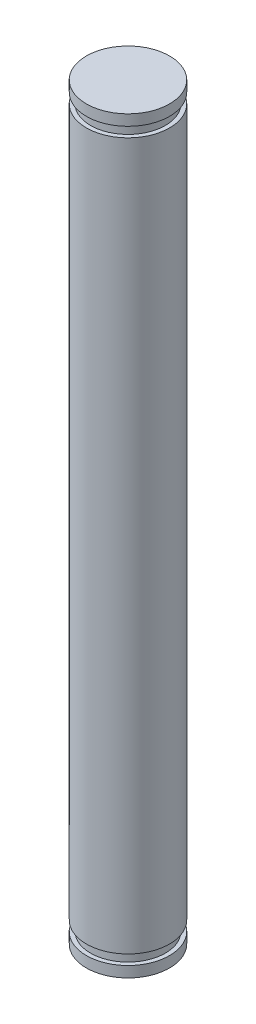
ISO-10303-21;
HEADER;
FILE_DESCRIPTION(('STEP AP214'),'2;1');
FILE_NAME('part.step','',(''),(''),'','','');
FILE_SCHEMA(('AUTOMOTIVE_DESIGN { 1 0 10303 214 1 1 1 1 }'));
ENDSEC;
DATA;
#1=APPLICATION_CONTEXT('core data for automotive mechanical design processes');
#2=APPLICATION_PROTOCOL_DEFINITION('international standard','automotive_design',2000,#1);
#3=PRODUCT_CONTEXT('',#1,'mechanical');
#4=PRODUCT('Part','Part','',(#3));
#5=PRODUCT_RELATED_PRODUCT_CATEGORY('part','',(#4));
#6=PRODUCT_DEFINITION_FORMATION('','',#4);
#7=PRODUCT_DEFINITION_CONTEXT('part definition',#1,'design');
#8=PRODUCT_DEFINITION('design','',#6,#7);
#9=PRODUCT_DEFINITION_SHAPE('','',#8);
#10=(LENGTH_UNIT() NAMED_UNIT(*) SI_UNIT(.MILLI.,.METRE.));
#11=(NAMED_UNIT(*) PLANE_ANGLE_UNIT() SI_UNIT($,.RADIAN.));
#12=(NAMED_UNIT(*) SI_UNIT($,.STERADIAN.) SOLID_ANGLE_UNIT());
#13=UNCERTAINTY_MEASURE_WITH_UNIT(LENGTH_MEASURE(1.E-05),#10,'distance_accuracy_value','');
#14=(GEOMETRIC_REPRESENTATION_CONTEXT(3) GLOBAL_UNCERTAINTY_ASSIGNED_CONTEXT((#13)) GLOBAL_UNIT_ASSIGNED_CONTEXT((#10,
#11,#12)) REPRESENTATION_CONTEXT('',''));
#15=CARTESIAN_POINT('',(0.,0.,0.));
#16=DIRECTION('',(0.,0.,1.));
#17=DIRECTION('',(1.,0.,0.));
#18=AXIS2_PLACEMENT_3D('',#15,#16,#17);
#19=CARTESIAN_POINT('',(0.,0.,0.));
#20=DIRECTION('',(0.,-1.,0.));
#21=DIRECTION('',(1.,0.,0.));
#22=AXIS2_PLACEMENT_3D('',#19,#20,#21);
#23=PLANE('',#22);
#24=CARTESIAN_POINT('',(0.,0.,0.));
#25=DIRECTION('',(0.,1.,0.));
#26=DIRECTION('',(-1.,0.,0.));
#27=AXIS2_PLACEMENT_3D('',#24,#25,#26);
#28=CIRCLE('',#27,5.);
#29=CARTESIAN_POINT('',(-5.,0.,0.));
#30=VERTEX_POINT('',#29);
#31=EDGE_CURVE('E10',#30,#30,#28,.T.);
#32=ORIENTED_EDGE('',*,*,#31,.F.);
#33=EDGE_LOOP('',(#32));
#34=FACE_BOUND('',#33,.T.);
#35=ADVANCED_FACE('F34',(#34),#23,.T.);
#36=CARTESIAN_POINT('',(0.,90.,0.));
#37=DIRECTION('',(0.,1.,0.));
#38=DIRECTION('',(-1.,0.,0.));
#39=AXIS2_PLACEMENT_3D('',#36,#37,#38);
#40=CYLINDRICAL_SURFACE('',#39,5.);
#41=ORIENTED_EDGE('',*,*,#31,.T.);
#42=EDGE_LOOP('',(#41));
#43=FACE_BOUND('',#42,.T.);
#44=CARTESIAN_POINT('',(0.,1.3,0.));
#45=DIRECTION('',(0.,1.,0.));
#46=DIRECTION('',(-1.,0.,0.));
#47=AXIS2_PLACEMENT_3D('',#44,#45,#46);
#48=CIRCLE('',#47,5.);
#49=CARTESIAN_POINT('',(-5.,1.3,0.));
#50=VERTEX_POINT('',#49);
#51=EDGE_CURVE('E40',#50,#50,#48,.T.);
#52=ORIENTED_EDGE('',*,*,#51,.F.);
#53=EDGE_LOOP('',(#52));
#54=FACE_BOUND('',#53,.T.);
#55=ADVANCED_FACE('F88',(#43,#54),#40,.T.);
#56=CARTESIAN_POINT('',(-5.,1.3,0.));
#57=DIRECTION('',(0.,1.,0.));
#58=DIRECTION('',(-1.,0.,0.));
#59=AXIS2_PLACEMENT_3D('',#56,#57,#58);
#60=PLANE('',#59);
#61=ORIENTED_EDGE('',*,*,#51,.T.);
#62=EDGE_LOOP('',(#61));
#63=FACE_BOUND('',#62,.T.);
#64=CARTESIAN_POINT('',(0.,1.3,0.));
#65=DIRECTION('',(0.,1.,0.));
#66=DIRECTION('',(-1.,0.,0.));
#67=AXIS2_PLACEMENT_3D('',#64,#65,#66);
#68=CIRCLE('',#67,4.5);
#69=CARTESIAN_POINT('',(-4.5,1.3,0.));
#70=VERTEX_POINT('',#69);
#71=EDGE_CURVE('E44',#70,#70,#68,.T.);
#72=ORIENTED_EDGE('',*,*,#71,.F.);
#73=EDGE_LOOP('',(#72));
#74=FACE_BOUND('',#73,.T.);
#75=ADVANCED_FACE('F93',(#63,#74),#60,.T.);
#76=CARTESIAN_POINT('',(0.,90.,0.));
#77=DIRECTION('',(0.,1.,0.));
#78=DIRECTION('',(-1.,0.,0.));
#79=AXIS2_PLACEMENT_3D('',#76,#77,#78);
#80=CYLINDRICAL_SURFACE('',#79,4.5);
#81=ORIENTED_EDGE('',*,*,#71,.T.);
#82=EDGE_LOOP('',(#81));
#83=FACE_BOUND('',#82,.T.);
#84=CARTESIAN_POINT('',(0.,2.5,0.));
#85=DIRECTION('',(0.,1.,0.));
#86=DIRECTION('',(-1.,0.,0.));
#87=AXIS2_PLACEMENT_3D('',#84,#85,#86);
#88=CIRCLE('',#87,4.5);
#89=CARTESIAN_POINT('',(-4.5,2.5,0.));
#90=VERTEX_POINT('',#89);
#91=EDGE_CURVE('E48',#90,#90,#88,.T.);
#92=ORIENTED_EDGE('',*,*,#91,.F.);
#93=EDGE_LOOP('',(#92));
#94=FACE_BOUND('',#93,.T.);
#95=ADVANCED_FACE('F97',(#83,#94),#80,.T.);
#96=CARTESIAN_POINT('',(-4.5,2.5,0.));
#97=DIRECTION('',(0.,-1.,0.));
#98=DIRECTION('',(1.,0.,0.));
#99=AXIS2_PLACEMENT_3D('',#96,#97,#98);
#100=PLANE('',#99);
#101=ORIENTED_EDGE('',*,*,#91,.T.);
#102=EDGE_LOOP('',(#101));
#103=FACE_BOUND('',#102,.T.);
#104=CARTESIAN_POINT('',(0.,2.5,0.));
#105=DIRECTION('',(0.,1.,0.));
#106=DIRECTION('',(-1.,0.,0.));
#107=AXIS2_PLACEMENT_3D('',#104,#105,#106);
#108=CIRCLE('',#107,5.);
#109=CARTESIAN_POINT('',(-5.,2.5,0.));
#110=VERTEX_POINT('',#109);
#111=EDGE_CURVE('E53',#110,#110,#108,.T.);
#112=ORIENTED_EDGE('',*,*,#111,.F.);
#113=EDGE_LOOP('',(#112));
#114=FACE_BOUND('',#113,.T.);
#115=ADVANCED_FACE('F103',(#103,#114),#100,.T.);
#116=CARTESIAN_POINT('',(0.,90.,0.));
#117=DIRECTION('',(0.,1.,0.));
#118=DIRECTION('',(-1.,0.,0.));
#119=AXIS2_PLACEMENT_3D('',#116,#117,#118);
#120=CYLINDRICAL_SURFACE('',#119,5.);
#121=ORIENTED_EDGE('',*,*,#111,.T.);
#122=EDGE_LOOP('',(#121));
#123=FACE_BOUND('',#122,.T.);
#124=CARTESIAN_POINT('',(0.,87.5,0.));
#125=DIRECTION('',(0.,1.,0.));
#126=DIRECTION('',(-1.,0.,0.));
#127=AXIS2_PLACEMENT_3D('',#124,#125,#126);
#128=CIRCLE('',#127,5.);
#129=CARTESIAN_POINT('',(-5.,87.5,0.));
#130=VERTEX_POINT('',#129);
#131=EDGE_CURVE('E56',#130,#130,#128,.T.);
#132=ORIENTED_EDGE('',*,*,#131,.F.);
#133=EDGE_LOOP('',(#132));
#134=FACE_BOUND('',#133,.T.);
#135=ADVANCED_FACE('F107',(#123,#134),#120,.T.);
#136=CARTESIAN_POINT('',(-5.,87.5,0.));
#137=DIRECTION('',(0.,1.,0.));
#138=DIRECTION('',(-1.,0.,0.));
#139=AXIS2_PLACEMENT_3D('',#136,#137,#138);
#140=PLANE('',#139);
#141=ORIENTED_EDGE('',*,*,#131,.T.);
#142=EDGE_LOOP('',(#141));
#143=FACE_BOUND('',#142,.T.);
#144=CARTESIAN_POINT('',(0.,87.5,0.));
#145=DIRECTION('',(0.,1.,0.));
#146=DIRECTION('',(-1.,0.,0.));
#147=AXIS2_PLACEMENT_3D('',#144,#145,#146);
#148=CIRCLE('',#147,4.5);
#149=CARTESIAN_POINT('',(-4.5,87.5,0.));
#150=VERTEX_POINT('',#149);
#151=EDGE_CURVE('E59',#150,#150,#148,.T.);
#152=ORIENTED_EDGE('',*,*,#151,.F.);
#153=EDGE_LOOP('',(#152));
#154=FACE_BOUND('',#153,.T.);
#155=ADVANCED_FACE('F111',(#143,#154),#140,.T.);
#156=CARTESIAN_POINT('',(0.,90.,0.));
#157=DIRECTION('',(0.,1.,0.));
#158=DIRECTION('',(-1.,0.,0.));
#159=AXIS2_PLACEMENT_3D('',#156,#157,#158);
#160=CYLINDRICAL_SURFACE('',#159,4.5);
#161=ORIENTED_EDGE('',*,*,#151,.T.);
#162=EDGE_LOOP('',(#161));
#163=FACE_BOUND('',#162,.T.);
#164=CARTESIAN_POINT('',(0.,88.7,0.));
#165=DIRECTION('',(0.,1.,0.));
#166=DIRECTION('',(-1.,0.,0.));
#167=AXIS2_PLACEMENT_3D('',#164,#165,#166);
#168=CIRCLE('',#167,4.5);
#169=CARTESIAN_POINT('',(-4.5,88.7,0.));
#170=VERTEX_POINT('',#169);
#171=EDGE_CURVE('E62',#170,#170,#168,.T.);
#172=ORIENTED_EDGE('',*,*,#171,.F.);
#173=EDGE_LOOP('',(#172));
#174=FACE_BOUND('',#173,.T.);
#175=ADVANCED_FACE('F84',(#163,#174),#160,.T.);
#176=CARTESIAN_POINT('',(-4.5,88.7,0.));
#177=DIRECTION('',(0.,-1.,0.));
#178=DIRECTION('',(1.,0.,0.));
#179=AXIS2_PLACEMENT_3D('',#176,#177,#178);
#180=PLANE('',#179);
#181=ORIENTED_EDGE('',*,*,#171,.T.);
#182=EDGE_LOOP('',(#181));
#183=FACE_BOUND('',#182,.T.);
#184=CARTESIAN_POINT('',(0.,88.7,0.));
#185=DIRECTION('',(0.,1.,0.));
#186=DIRECTION('',(-1.,0.,0.));
#187=AXIS2_PLACEMENT_3D('',#184,#185,#186);
#188=CIRCLE('',#187,5.);
#189=CARTESIAN_POINT('',(-5.,88.7,0.));
#190=VERTEX_POINT('',#189);
#191=EDGE_CURVE('E65',#190,#190,#188,.T.);
#192=ORIENTED_EDGE('',*,*,#191,.F.);
#193=EDGE_LOOP('',(#192));
#194=FACE_BOUND('',#193,.T.);
#195=ADVANCED_FACE('F76',(#183,#194),#180,.T.);
#196=CARTESIAN_POINT('',(0.,90.,0.));
#197=DIRECTION('',(0.,1.,0.));
#198=DIRECTION('',(-1.,0.,0.));
#199=AXIS2_PLACEMENT_3D('',#196,#197,#198);
#200=CYLINDRICAL_SURFACE('',#199,5.);
#201=ORIENTED_EDGE('',*,*,#191,.T.);
#202=EDGE_LOOP('',(#201));
#203=FACE_BOUND('',#202,.T.);
#204=CARTESIAN_POINT('',(0.,90.,0.));
#205=DIRECTION('',(0.,1.,0.));
#206=DIRECTION('',(-1.,0.,0.));
#207=AXIS2_PLACEMENT_3D('',#204,#205,#206);
#208=CIRCLE('',#207,5.);
#209=CARTESIAN_POINT('',(-5.,90.,0.));
#210=VERTEX_POINT('',#209);
#211=EDGE_CURVE('E68',#210,#210,#208,.T.);
#212=ORIENTED_EDGE('',*,*,#211,.F.);
#213=EDGE_LOOP('',(#212));
#214=FACE_BOUND('',#213,.T.);
#215=ADVANCED_FACE('F74',(#203,#214),#200,.T.);
#216=CARTESIAN_POINT('',(-5.,90.,0.));
#217=DIRECTION('',(0.,1.,0.));
#218=DIRECTION('',(-1.,0.,0.));
#219=AXIS2_PLACEMENT_3D('',#216,#217,#218);
#220=PLANE('',#219);
#221=ORIENTED_EDGE('',*,*,#211,.T.);
#222=EDGE_LOOP('',(#221));
#223=FACE_BOUND('',#222,.T.);
#224=ADVANCED_FACE('F72',(#223),#220,.T.);
#225=CLOSED_SHELL('',(#35,#55,#75,#95,#115,#135,#155,#175,#195,#215,#224));
#226=MANIFOLD_SOLID_BREP('B2',#225);
#227=ADVANCED_BREP_SHAPE_REPRESENTATION('',(#18,#226),#14);
#228=SHAPE_DEFINITION_REPRESENTATION(#9,#227);
ENDSEC;
END-ISO-10303-21;
